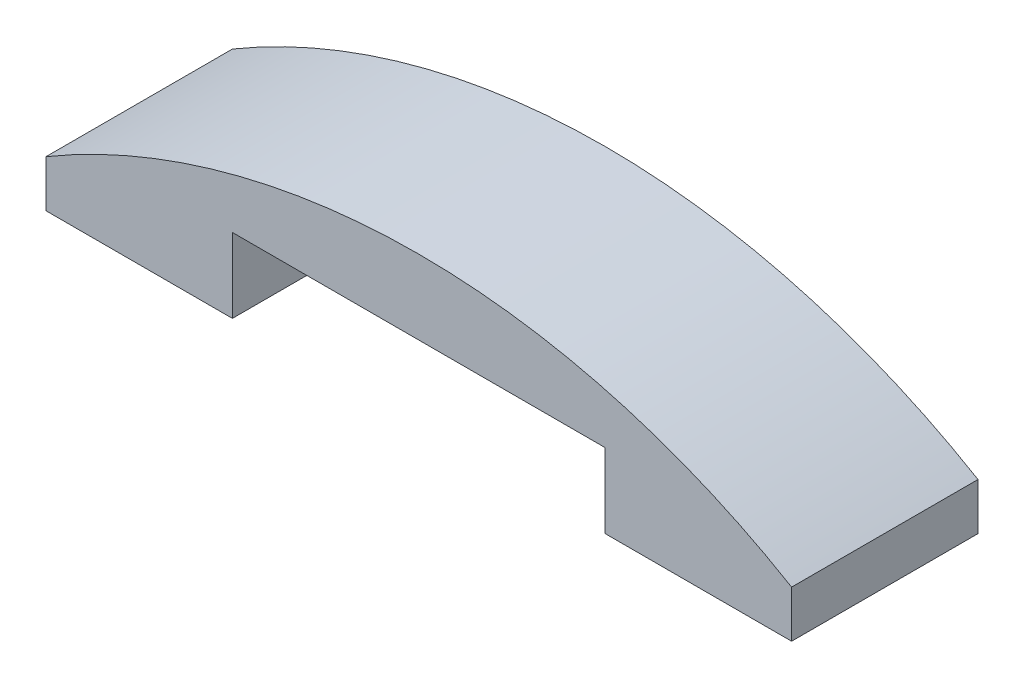
ISO-10303-21;
HEADER;
FILE_DESCRIPTION(('STEP AP214'),'2;1');
FILE_NAME('part.step','',(''),(''),'','','');
FILE_SCHEMA(('AUTOMOTIVE_DESIGN { 1 0 10303 214 1 1 1 1 }'));
ENDSEC;
DATA;
#1=APPLICATION_CONTEXT('core data for automotive mechanical design processes');
#2=APPLICATION_PROTOCOL_DEFINITION('international standard','automotive_design',2000,#1);
#3=PRODUCT_CONTEXT('',#1,'mechanical');
#4=PRODUCT('Part','Part','',(#3));
#5=PRODUCT_RELATED_PRODUCT_CATEGORY('part','',(#4));
#6=PRODUCT_DEFINITION_FORMATION('','',#4);
#7=PRODUCT_DEFINITION_CONTEXT('part definition',#1,'design');
#8=PRODUCT_DEFINITION('design','',#6,#7);
#9=PRODUCT_DEFINITION_SHAPE('','',#8);
#10=(LENGTH_UNIT() NAMED_UNIT(*) SI_UNIT(.MILLI.,.METRE.));
#11=(NAMED_UNIT(*) PLANE_ANGLE_UNIT() SI_UNIT($,.RADIAN.));
#12=(NAMED_UNIT(*) SI_UNIT($,.STERADIAN.) SOLID_ANGLE_UNIT());
#13=UNCERTAINTY_MEASURE_WITH_UNIT(LENGTH_MEASURE(1.E-05),#10,'distance_accuracy_value','');
#14=(GEOMETRIC_REPRESENTATION_CONTEXT(3) GLOBAL_UNCERTAINTY_ASSIGNED_CONTEXT((#13)) GLOBAL_UNIT_ASSIGNED_CONTEXT((#10,
#11,#12)) REPRESENTATION_CONTEXT('',''));
#15=CARTESIAN_POINT('',(0.,0.,0.));
#16=DIRECTION('',(0.,0.,1.));
#17=DIRECTION('',(1.,0.,0.));
#18=AXIS2_PLACEMENT_3D('',#15,#16,#17);
#19=CARTESIAN_POINT('',(0.,-24.8836206896552,7.95));
#20=DIRECTION('',(0.,0.,-1.));
#21=DIRECTION('',(-1.,0.,0.));
#22=AXIS2_PLACEMENT_3D('',#19,#20,#21);
#23=CYLINDRICAL_SURFACE('',#22,30.5336206896552);
#24=CARTESIAN_POINT('',(0.,-24.8836206896552,0.699999999999999));
#25=DIRECTION('',(0.,0.,-1.));
#26=DIRECTION('',(-1.,0.,0.));
#27=AXIS2_PLACEMENT_3D('',#24,#25,#26);
#28=CIRCLE('',#27,30.5336206896552);
#29=CARTESIAN_POINT('',(15.2,1.59773109645533,0.699999999999999));
#30=VERTEX_POINT('',#29);
#31=CARTESIAN_POINT('',(-15.2,1.59773109645533,0.699999999999999));
#32=VERTEX_POINT('',#31);
#33=EDGE_CURVE('E184',#30,#32,#28,.F.);
#34=ORIENTED_EDGE('',*,*,#33,.F.);
#35=DIRECTION('',(0.,0.,-1.));
#36=VECTOR('',#35,1.);
#37=CARTESIAN_POINT('',(15.2,1.59773109645533,7.25));
#38=LINE('',#37,#36);
#39=CARTESIAN_POINT('',(15.2,1.59773109645533,7.25));
#40=VERTEX_POINT('',#39);
#41=EDGE_CURVE('E171',#40,#30,#38,.T.);
#42=ORIENTED_EDGE('',*,*,#41,.F.);
#43=CARTESIAN_POINT('',(0.,-24.8836206896552,7.25));
#44=DIRECTION('',(0.,0.,-1.));
#45=DIRECTION('',(-1.,0.,0.));
#46=AXIS2_PLACEMENT_3D('',#43,#44,#45);
#47=CIRCLE('',#46,30.5336206896552);
#48=CARTESIAN_POINT('',(-15.2,1.59773109645533,7.25));
#49=VERTEX_POINT('',#48);
#50=EDGE_CURVE('E177',#40,#49,#47,.F.);
#51=ORIENTED_EDGE('',*,*,#50,.T.);
#52=DIRECTION('',(0.,0.,-1.));
#53=VECTOR('',#52,1.);
#54=CARTESIAN_POINT('',(-15.2,1.59773109645533,7.25));
#55=LINE('',#54,#53);
#56=EDGE_CURVE('E185',#49,#32,#55,.T.);
#57=ORIENTED_EDGE('',*,*,#56,.T.);
#58=EDGE_LOOP('',(#34,#42,#51,#57));
#59=FACE_BOUND('',#58,.T.);
#60=CARTESIAN_POINT('',(0.,5.65,5.525));
#61=CARTESIAN_POINT('',(0.0870040594812946,5.64999947383263,5.52499616086373));
#62=CARTESIAN_POINT('',(0.174069776851064,5.64962414685411,5.51764987349513));
#63=CARTESIAN_POINT('',(0.345799254136158,5.64816297559538,5.48844832849267));
#64=CARTESIAN_POINT('',(0.430460063336178,5.64707629474054,5.46657598731988));
#65=CARTESIAN_POINT('',(0.594867213495364,5.64431540641607,5.40895028682981));
#66=CARTESIAN_POINT('',(0.674616039780241,5.64264149898557,5.37320401530595));
#67=CARTESIAN_POINT('',(0.826959805951322,5.63889466601426,5.28885608345966));
#68=CARTESIAN_POINT('',(0.89955642630858,5.63682183454369,5.2402574528418));
#69=CARTESIAN_POINT('',(1.03563187099162,5.63250792142471,5.13152830553152));
#70=CARTESIAN_POINT('',(1.09910235980805,5.63026668877285,5.07138736204052));
#71=CARTESIAN_POINT('',(1.21505279789673,5.62586987508656,4.94130163683761));
#72=CARTESIAN_POINT('',(1.26753229765325,5.62371429755824,4.87135645434157));
#73=CARTESIAN_POINT('',(1.36003424530167,5.61973079485169,4.72360374708968));
#74=CARTESIAN_POINT('',(1.40005015233963,5.61790304192746,4.64579212232593));
#75=CARTESIAN_POINT('',(1.46644705505788,5.61478314796291,4.48454416873015));
#76=CARTESIAN_POINT('',(1.49282815656384,5.61349100276553,4.40110788355924));
#77=CARTESIAN_POINT('',(1.53118447856174,5.61158940726855,4.23105601783902));
#78=CARTESIAN_POINT('',(1.54317221595444,5.61097936382463,4.14444326729827));
#79=CARTESIAN_POINT('',(1.55244014216201,5.61050898474049,3.97043283248053));
#80=CARTESIAN_POINT('',(1.54972044980338,5.61064864304317,3.88303515455092));
#81=CARTESIAN_POINT('',(1.52966114304942,5.6116613671164,3.71002085556066));
#82=CARTESIAN_POINT('',(1.51233505399109,5.61253375438651,3.62440266184831));
#83=CARTESIAN_POINT('',(1.46357573876816,5.61491254189686,3.457291543204));
#84=CARTESIAN_POINT('',(1.43214245162424,5.61641894487767,3.37579863610558));
#85=CARTESIAN_POINT('',(1.35604557478348,5.61989676227944,3.21920781000301));
#86=CARTESIAN_POINT('',(1.31137582045836,5.62186839328401,3.14411289176643));
#87=CARTESIAN_POINT('',(1.21007850968265,5.62605422576914,3.00248253326573));
#88=CARTESIAN_POINT('',(1.15345086610146,5.62826842901713,2.93594715537599));
#89=CARTESIAN_POINT('',(1.02976891002292,5.63269286119406,2.81324585202942));
#90=CARTESIAN_POINT('',(0.962702885358677,5.63490308280266,2.75709173140195));
#91=CARTESIAN_POINT('',(0.820089081771725,5.63906802981405,2.656837922189));
#92=CARTESIAN_POINT('',(0.744541300720823,5.64102275515273,2.61273823662816));
#93=CARTESIAN_POINT('',(0.587101589759732,5.64445650017159,2.537846250763));
#94=CARTESIAN_POINT('',(0.505209462645692,5.64593550505738,2.50705436430619));
#95=CARTESIAN_POINT('',(0.337408747817767,5.6482509095457,2.45965977084655));
#96=CARTESIAN_POINT('',(0.251500191098295,5.64908731410624,2.44305695436703));
#97=CARTESIAN_POINT('',(0.07820772455836,5.6500226171265,2.42452634769985));
#98=CARTESIAN_POINT('',(-0.00917443505672073,5.65012233615205,2.42258222969909));
#99=CARTESIAN_POINT('',(-0.183023733180197,5.64957520850135,2.43338159337494));
#100=CARTESIAN_POINT('',(-0.269490874808616,5.64892836437156,2.44612502495372));
#101=CARTESIAN_POINT('',(-0.439009884936366,5.64696149235882,2.48592423399739));
#102=CARTESIAN_POINT('',(-0.522063508633462,5.64564181524061,2.51297255423852));
#103=CARTESIAN_POINT('',(-0.682451968189103,5.64247784890565,2.58060617674385));
#104=CARTESIAN_POINT('',(-0.759786770104113,5.64063355657542,2.62119155934816));
#105=CARTESIAN_POINT('',(-0.906617294697866,5.63662577622214,2.71478902627817));
#106=CARTESIAN_POINT('',(-0.976106034030486,5.63446200774204,2.76781205350667));
#107=CARTESIAN_POINT('',(-1.10520168268703,5.63005988316925,2.88476369565647));
#108=CARTESIAN_POINT('',(-1.16480852676326,5.62782152658421,2.94869238257948));
#109=CARTESIAN_POINT('',(-1.27250335346789,5.62352016923219,3.08571089456004));
#110=CARTESIAN_POINT('',(-1.32058077029914,5.62145733042149,3.15880902997345));
#111=CARTESIAN_POINT('',(-1.4037797836461,5.61774217366867,3.31204947168775));
#112=CARTESIAN_POINT('',(-1.4389014378427,5.61608985389887,3.39219174662516));
#113=CARTESIAN_POINT('',(-1.49517353562003,5.61338321702781,3.55720640852777));
#114=CARTESIAN_POINT('',(-1.51633071021749,5.61232861185692,3.64207649521712));
#115=CARTESIAN_POINT('',(-1.54409528746996,5.61093551914881,3.81416980841175));
#116=CARTESIAN_POINT('',(-1.5507027761008,5.61059702737999,3.90139302100905));
#117=CARTESIAN_POINT('',(-1.54917960342835,5.61067443722686,4.07561147078868));
#118=CARTESIAN_POINT('',(-1.54106556324304,5.61108948806709,4.16260685415623));
#119=CARTESIAN_POINT('',(-1.51036402411425,5.61262540617683,4.33399855507478));
#120=CARTESIAN_POINT('',(-1.48777649765172,5.61374627478835,4.41839486768374));
#121=CARTESIAN_POINT('',(-1.42877258084142,5.61656730633899,4.5821961434822));
#122=CARTESIAN_POINT('',(-1.39235609788731,5.6182674731574,4.66160107324249));
#123=CARTESIAN_POINT('',(-1.30673082172142,5.62205542846763,4.81317097542763));
#124=CARTESIAN_POINT('',(-1.25752241765201,5.62414320516744,4.88533616799962));
#125=CARTESIAN_POINT('',(-1.14765046972581,5.62847376546093,5.02046121169804));
#126=CARTESIAN_POINT('',(-1.08697530441116,5.63071670483568,5.08341160784033));
#127=CARTESIAN_POINT('',(-0.955900487069461,5.63510367892759,5.19825271200747));
#128=CARTESIAN_POINT('',(-0.885498447109781,5.63724768918486,5.25014069624798));
#129=CARTESIAN_POINT('',(-0.736911724777956,5.64119673247876,5.34140908518008));
#130=CARTESIAN_POINT('',(-0.658719534445111,5.64300143356644,5.38077726740762));
#131=CARTESIAN_POINT('',(-0.496884513941508,5.64606356924861,5.44577958295773));
#132=CARTESIAN_POINT('',(-0.4132482504971,5.64732164961916,5.47142993080909));
#133=CARTESIAN_POINT('',(-0.274243987250401,5.64881619248384,5.50154367405768));
#134=CARTESIAN_POINT('',(-0.219776243909713,5.64925816814422,5.51032855844854));
#135=CARTESIAN_POINT('',(-0.11021391558148,5.64985023844403,5.52205793494242));
#136=CARTESIAN_POINT('',(-0.055119331146409,5.65000033334069,5.52500243219253));
#137=CARTESIAN_POINT('',(0.,5.65,5.525));
#138=B_SPLINE_CURVE_WITH_KNOTS('',3,(#60,#61,#62,#63,#64,#65,#66,#67,#68,#69,#70,#71,#72,#73,
#74,#75,#76,#77,#78,#79,#80,#81,#82,#83,#84,#85,#86,#87,#88,#89,#90,#91,#92,#93,#94,#95,#96,#97,
#98,#99,#100,#101,#102,#103,#104,#105,#106,#107,#108,#109,#110,#111,#112,#113,#114,#115,#116,
#117,#118,#119,#120,#121,#122,#123,#124,#125,#126,#127,#128,#129,#130,#131,#132,#133,#134,#135,
#136,#137),.UNSPECIFIED.,.T.,.F.,(4,2,2,2,2,2,2,2,2,2,2,2,2,2,2,2,2,2,2,2,2,2,2,2,2,2,2,2,2,2,2,
2,2,2,2,2,2,2,4),(0.,0.260810971659144,0.521929217629925,0.782914240986913,1.04383779673422,
1.3049981779028,1.56616923807274,1.82747712994327,2.08878299365877,2.34986145299573,
2.61093780299117,2.87177266482337,3.13260865414271,3.39356631421826,3.65452587581513,
3.91578038098094,4.17703495169922,4.43829764635876,4.69955832521101,4.96052795185258,
5.22149668835457,5.48232951420407,5.74316388807828,6.00422861605442,6.26529506770754,
6.52659985934065,6.78790348759381,7.04908107276592,7.31025711460452,7.57113846308632,
7.83202030759428,8.09290389914225,8.35377955529258,8.6149210383719,8.87612674557459,
9.13758667771896,9.39873687639808,9.56396754573068,9.72919806944651),.UNSPECIFIED.);
#139=CARTESIAN_POINT('',(0.,5.65,5.525));
#140=VERTEX_POINT('',#139);
#141=EDGE_CURVE('E40',#140,#140,#138,.T.);
#142=ORIENTED_EDGE('',*,*,#141,.T.);
#143=EDGE_LOOP('',(#142));
#144=FACE_BOUND('',#143,.T.);
#145=ADVANCED_FACE('F36',(#59,#144),#23,.F.);
#146=CARTESIAN_POINT('',(-7.95,0.,7.95));
#147=DIRECTION('',(0.,1.,0.));
#148=DIRECTION('',(-1.,0.,0.));
#149=AXIS2_PLACEMENT_3D('',#146,#147,#148);
#150=PLANE('',#149);
#151=DIRECTION('',(1.,0.,0.));
#152=VECTOR('',#151,1.);
#153=CARTESIAN_POINT('',(-7.95,0.,0.));
#154=LINE('',#153,#152);
#155=CARTESIAN_POINT('',(-15.9,0.,0.));
#156=VERTEX_POINT('',#155);
#157=CARTESIAN_POINT('',(-7.95,0.,0.));
#158=VERTEX_POINT('',#157);
#159=EDGE_CURVE('E222',#156,#158,#154,.T.);
#160=ORIENTED_EDGE('',*,*,#159,.T.);
#161=DIRECTION('',(0.,0.,-1.));
#162=VECTOR('',#161,1.);
#163=CARTESIAN_POINT('',(-7.95,0.,7.95));
#164=LINE('',#163,#162);
#165=CARTESIAN_POINT('',(-7.95,0.,7.95));
#166=VERTEX_POINT('',#165);
#167=EDGE_CURVE('E295',#166,#158,#164,.T.);
#168=ORIENTED_EDGE('',*,*,#167,.F.);
#169=DIRECTION('',(1.,0.,0.));
#170=VECTOR('',#169,1.);
#171=CARTESIAN_POINT('',(-7.95,0.,7.95));
#172=LINE('',#171,#170);
#173=CARTESIAN_POINT('',(-15.9,0.,7.95));
#174=VERTEX_POINT('',#173);
#175=EDGE_CURVE('E236',#174,#166,#172,.T.);
#176=ORIENTED_EDGE('',*,*,#175,.F.);
#177=DIRECTION('',(0.,0.,-1.));
#178=VECTOR('',#177,1.);
#179=CARTESIAN_POINT('',(-15.9,0.,7.95));
#180=LINE('',#179,#178);
#181=EDGE_CURVE('E254',#174,#156,#180,.T.);
#182=ORIENTED_EDGE('',*,*,#181,.T.);
#183=EDGE_LOOP('',(#160,#168,#176,#182));
#184=FACE_BOUND('',#183,.T.);
#185=DIRECTION('',(1.,0.,0.));
#186=VECTOR('',#185,1.);
#187=CARTESIAN_POINT('',(0.,0.,0.699999999999999));
#188=LINE('',#187,#186);
#189=CARTESIAN_POINT('',(-15.2,0.,0.699999999999999));
#190=VERTEX_POINT('',#189);
#191=CARTESIAN_POINT('',(-8.65,0.,0.699999999999999));
#192=VERTEX_POINT('',#191);
#193=EDGE_CURVE('E227',#190,#192,#188,.T.);
#194=ORIENTED_EDGE('',*,*,#193,.F.);
#195=DIRECTION('',(0.,0.,-1.));
#196=VECTOR('',#195,1.);
#197=CARTESIAN_POINT('',(-15.2,0.,7.95));
#198=LINE('',#197,#196);
#199=CARTESIAN_POINT('',(-15.2,0.,7.25));
#200=VERTEX_POINT('',#199);
#201=EDGE_CURVE('E190',#200,#190,#198,.T.);
#202=ORIENTED_EDGE('',*,*,#201,.F.);
#203=DIRECTION('',(1.,0.,0.));
#204=VECTOR('',#203,1.);
#205=CARTESIAN_POINT('',(0.,0.,7.25));
#206=LINE('',#205,#204);
#207=CARTESIAN_POINT('',(-8.65,0.,7.25));
#208=VERTEX_POINT('',#207);
#209=EDGE_CURVE('E57',#200,#208,#206,.T.);
#210=ORIENTED_EDGE('',*,*,#209,.T.);
#211=DIRECTION('',(0.,0.,-1.));
#212=VECTOR('',#211,1.);
#213=CARTESIAN_POINT('',(-8.65,0.,7.95));
#214=LINE('',#213,#212);
#215=EDGE_CURVE('E207',#208,#192,#214,.T.);
#216=ORIENTED_EDGE('',*,*,#215,.T.);
#217=EDGE_LOOP('',(#194,#202,#210,#216));
#218=FACE_BOUND('',#217,.T.);
#219=ADVANCED_FACE('F38',(#184,#218),#150,.F.);
#220=CARTESIAN_POINT('',(-7.95,3.175,7.95));
#221=DIRECTION('',(0.,1.,0.));
#222=DIRECTION('',(0.,0.,1.));
#223=AXIS2_PLACEMENT_3D('',#220,#221,#222);
#224=PLANE('',#223);
#225=DIRECTION('',(1.,0.,0.));
#226=VECTOR('',#225,1.);
#227=CARTESIAN_POINT('',(0.,3.175,0.699999999999999));
#228=LINE('',#227,#226);
#229=CARTESIAN_POINT('',(-7.95,3.175,0.699999999999999));
#230=VERTEX_POINT('',#229);
#231=CARTESIAN_POINT('',(7.95,3.175,0.699999999999999));
#232=VERTEX_POINT('',#231);
#233=EDGE_CURVE('E50',#230,#232,#228,.T.);
#234=ORIENTED_EDGE('',*,*,#233,.F.);
#235=DIRECTION('',(0.,0.,-1.));
#236=VECTOR('',#235,1.);
#237=CARTESIAN_POINT('',(-7.95,3.175,7.95));
#238=LINE('',#237,#236);
#239=CARTESIAN_POINT('',(-7.95,3.175,0.));
#240=VERTEX_POINT('',#239);
#241=EDGE_CURVE('E290',#230,#240,#238,.T.);
#242=ORIENTED_EDGE('',*,*,#241,.T.);
#243=DIRECTION('',(1.,0.,0.));
#244=VECTOR('',#243,1.);
#245=CARTESIAN_POINT('',(-7.95,3.175,0.));
#246=LINE('',#245,#244);
#247=CARTESIAN_POINT('',(7.95,3.175,0.));
#248=VERTEX_POINT('',#247);
#249=EDGE_CURVE('E260',#240,#248,#246,.T.);
#250=ORIENTED_EDGE('',*,*,#249,.T.);
#251=DIRECTION('',(0.,0.,-1.));
#252=VECTOR('',#251,1.);
#253=CARTESIAN_POINT('',(7.95,3.175,7.95));
#254=LINE('',#253,#252);
#255=EDGE_CURVE('E286',#232,#248,#254,.T.);
#256=ORIENTED_EDGE('',*,*,#255,.F.);
#257=EDGE_LOOP('',(#234,#242,#250,#256));
#258=FACE_BOUND('',#257,.T.);
#259=ADVANCED_FACE('F339',(#258),#224,.F.);
#260=CARTESIAN_POINT('',(7.95,0.,7.95));
#261=DIRECTION('',(0.,1.,0.));
#262=DIRECTION('',(-1.,0.,0.));
#263=AXIS2_PLACEMENT_3D('',#260,#261,#262);
#264=PLANE('',#263);
#265=DIRECTION('',(1.,0.,0.));
#266=VECTOR('',#265,1.);
#267=CARTESIAN_POINT('',(7.95,0.,0.));
#268=LINE('',#267,#266);
#269=CARTESIAN_POINT('',(7.95,0.,0.));
#270=VERTEX_POINT('',#269);
#271=CARTESIAN_POINT('',(15.9,0.,0.));
#272=VERTEX_POINT('',#271);
#273=EDGE_CURVE('E265',#270,#272,#268,.T.);
#274=ORIENTED_EDGE('',*,*,#273,.T.);
#275=DIRECTION('',(0.,0.,-1.));
#276=VECTOR('',#275,1.);
#277=CARTESIAN_POINT('',(15.9,0.,7.95));
#278=LINE('',#277,#276);
#279=CARTESIAN_POINT('',(15.9,0.,7.95));
#280=VERTEX_POINT('',#279);
#281=EDGE_CURVE('E280',#280,#272,#278,.T.);
#282=ORIENTED_EDGE('',*,*,#281,.F.);
#283=DIRECTION('',(1.,0.,0.));
#284=VECTOR('',#283,1.);
#285=CARTESIAN_POINT('',(7.95,0.,7.95));
#286=LINE('',#285,#284);
#287=CARTESIAN_POINT('',(7.95,0.,7.95));
#288=VERTEX_POINT('',#287);
#289=EDGE_CURVE('E246',#288,#280,#286,.T.);
#290=ORIENTED_EDGE('',*,*,#289,.F.);
#291=DIRECTION('',(0.,0.,-1.));
#292=VECTOR('',#291,1.);
#293=CARTESIAN_POINT('',(7.95,0.,7.95));
#294=LINE('',#293,#292);
#295=EDGE_CURVE('E283',#288,#270,#294,.T.);
#296=ORIENTED_EDGE('',*,*,#295,.T.);
#297=EDGE_LOOP('',(#274,#282,#290,#296));
#298=FACE_BOUND('',#297,.T.);
#299=DIRECTION('',(1.,0.,0.));
#300=VECTOR('',#299,1.);
#301=CARTESIAN_POINT('',(0.,0.,0.699999999999999));
#302=LINE('',#301,#300);
#303=CARTESIAN_POINT('',(8.65,0.,0.699999999999999));
#304=VERTEX_POINT('',#303);
#305=CARTESIAN_POINT('',(15.2,0.,0.699999999999999));
#306=VERTEX_POINT('',#305);
#307=EDGE_CURVE('E196',#304,#306,#302,.T.);
#308=ORIENTED_EDGE('',*,*,#307,.F.);
#309=DIRECTION('',(0.,0.,-1.));
#310=VECTOR('',#309,1.);
#311=CARTESIAN_POINT('',(8.65,0.,7.95));
#312=LINE('',#311,#310);
#313=CARTESIAN_POINT('',(8.65,0.,7.25));
#314=VERTEX_POINT('',#313);
#315=EDGE_CURVE('E214',#314,#304,#312,.T.);
#316=ORIENTED_EDGE('',*,*,#315,.F.);
#317=DIRECTION('',(1.,0.,0.));
#318=VECTOR('',#317,1.);
#319=CARTESIAN_POINT('',(0.,0.,7.25));
#320=LINE('',#319,#318);
#321=CARTESIAN_POINT('',(15.2,0.,7.25));
#322=VERTEX_POINT('',#321);
#323=EDGE_CURVE('E178',#314,#322,#320,.T.);
#324=ORIENTED_EDGE('',*,*,#323,.T.);
#325=DIRECTION('',(0.,0.,-1.));
#326=VECTOR('',#325,1.);
#327=CARTESIAN_POINT('',(15.2,0.,7.95));
#328=LINE('',#327,#326);
#329=EDGE_CURVE('E174',#322,#306,#328,.T.);
#330=ORIENTED_EDGE('',*,*,#329,.T.);
#331=EDGE_LOOP('',(#308,#316,#324,#330));
#332=FACE_BOUND('',#331,.T.);
#333=ADVANCED_FACE('F367',(#298,#332),#264,.F.);
#334=CARTESIAN_POINT('',(-7.95,0.,7.95));
#335=DIRECTION('',(-1.,0.,0.));
#336=DIRECTION('',(0.,0.,1.));
#337=AXIS2_PLACEMENT_3D('',#334,#335,#336);
#338=PLANE('',#337);
#339=DIRECTION('',(0.,1.,0.));
#340=VECTOR('',#339,1.);
#341=CARTESIAN_POINT('',(-7.95,0.,0.));
#342=LINE('',#341,#340);
#343=EDGE_CURVE('E257',#158,#240,#342,.T.);
#344=ORIENTED_EDGE('',*,*,#343,.T.);
#345=ORIENTED_EDGE('',*,*,#241,.F.);
#346=CARTESIAN_POINT('',(-7.95,3.175,7.25));
#347=VERTEX_POINT('',#346);
#348=EDGE_CURVE('E296',#347,#230,#238,.T.);
#349=ORIENTED_EDGE('',*,*,#348,.F.);
#350=CARTESIAN_POINT('',(-7.95,3.175,7.95));
#351=VERTEX_POINT('',#350);
#352=EDGE_CURVE('E292',#351,#347,#238,.T.);
#353=ORIENTED_EDGE('',*,*,#352,.F.);
#354=DIRECTION('',(0.,1.,0.));
#355=VECTOR('',#354,1.);
#356=CARTESIAN_POINT('',(-7.95,0.,7.95));
#357=LINE('',#356,#355);
#358=EDGE_CURVE('E239',#166,#351,#357,.T.);
#359=ORIENTED_EDGE('',*,*,#358,.F.);
#360=ORIENTED_EDGE('',*,*,#167,.T.);
#361=EDGE_LOOP('',(#344,#345,#349,#353,#359,#360));
#362=FACE_BOUND('',#361,.T.);
#363=ADVANCED_FACE('F393',(#362),#338,.F.);
#364=ORIENTED_EDGE('',*,*,#352,.T.);
#365=DIRECTION('',(1.,0.,0.));
#366=VECTOR('',#365,1.);
#367=CARTESIAN_POINT('',(0.,3.175,7.25));
#368=LINE('',#367,#366);
#369=CARTESIAN_POINT('',(7.95,3.175,7.25));
#370=VERTEX_POINT('',#369);
#371=EDGE_CURVE('E219',#347,#370,#368,.T.);
#372=ORIENTED_EDGE('',*,*,#371,.T.);
#373=CARTESIAN_POINT('',(7.95,3.175,7.95));
#374=VERTEX_POINT('',#373);
#375=EDGE_CURVE('E287',#374,#370,#254,.T.);
#376=ORIENTED_EDGE('',*,*,#375,.F.);
#377=DIRECTION('',(1.,0.,0.));
#378=VECTOR('',#377,1.);
#379=CARTESIAN_POINT('',(-7.95,3.175,7.95));
#380=LINE('',#379,#378);
#381=EDGE_CURVE('E242',#351,#374,#380,.T.);
#382=ORIENTED_EDGE('',*,*,#381,.F.);
#383=EDGE_LOOP('',(#364,#372,#376,#382));
#384=FACE_BOUND('',#383,.T.);
#385=ADVANCED_FACE('F377',(#384),#224,.F.);
#386=CARTESIAN_POINT('',(7.95,3.175,7.95));
#387=DIRECTION('',(1.,0.,0.));
#388=DIRECTION('',(0.,0.,-1.));
#389=AXIS2_PLACEMENT_3D('',#386,#387,#388);
#390=PLANE('',#389);
#391=DIRECTION('',(0.,-1.,0.));
#392=VECTOR('',#391,1.);
#393=CARTESIAN_POINT('',(7.95,3.175,0.));
#394=LINE('',#393,#392);
#395=EDGE_CURVE('E263',#248,#270,#394,.T.);
#396=ORIENTED_EDGE('',*,*,#395,.T.);
#397=ORIENTED_EDGE('',*,*,#295,.F.);
#398=DIRECTION('',(0.,-1.,0.));
#399=VECTOR('',#398,1.);
#400=CARTESIAN_POINT('',(7.95,3.175,7.95));
#401=LINE('',#400,#399);
#402=EDGE_CURVE('E244',#374,#288,#401,.T.);
#403=ORIENTED_EDGE('',*,*,#402,.F.);
#404=ORIENTED_EDGE('',*,*,#375,.T.);
#405=EDGE_CURVE('E291',#370,#232,#254,.T.);
#406=ORIENTED_EDGE('',*,*,#405,.T.);
#407=ORIENTED_EDGE('',*,*,#255,.T.);
#408=EDGE_LOOP('',(#396,#397,#403,#404,#406,#407));
#409=FACE_BOUND('',#408,.T.);
#410=ADVANCED_FACE('F383',(#409),#390,.F.);
#411=CARTESIAN_POINT('',(15.9,0.,7.95));
#412=DIRECTION('',(-1.,0.,0.));
#413=DIRECTION('',(0.,0.,1.));
#414=AXIS2_PLACEMENT_3D('',#411,#412,#413);
#415=PLANE('',#414);
#416=DIRECTION('',(0.,1.,0.));
#417=VECTOR('',#416,1.);
#418=CARTESIAN_POINT('',(15.9,0.,0.));
#419=LINE('',#418,#417);
#420=CARTESIAN_POINT('',(15.9,2.,0.));
#421=VERTEX_POINT('',#420);
#422=EDGE_CURVE('E267',#272,#421,#419,.T.);
#423=ORIENTED_EDGE('',*,*,#422,.T.);
#424=DIRECTION('',(0.,0.,-1.));
#425=VECTOR('',#424,1.);
#426=CARTESIAN_POINT('',(15.9,2.,7.95));
#427=LINE('',#426,#425);
#428=CARTESIAN_POINT('',(15.9,2.,7.95));
#429=VERTEX_POINT('',#428);
#430=EDGE_CURVE('E277',#429,#421,#427,.T.);
#431=ORIENTED_EDGE('',*,*,#430,.F.);
#432=DIRECTION('',(0.,1.,0.));
#433=VECTOR('',#432,1.);
#434=CARTESIAN_POINT('',(15.9,0.,7.95));
#435=LINE('',#434,#433);
#436=EDGE_CURVE('E248',#280,#429,#435,.T.);
#437=ORIENTED_EDGE('',*,*,#436,.F.);
#438=ORIENTED_EDGE('',*,*,#281,.T.);
#439=EDGE_LOOP('',(#423,#431,#437,#438));
#440=FACE_BOUND('',#439,.T.);
#441=ADVANCED_FACE('F409',(#440),#415,.F.);
#442=CARTESIAN_POINT('',(-15.9,0.,7.95));
#443=DIRECTION('',(1.,0.,0.));
#444=DIRECTION('',(0.,0.,-1.));
#445=AXIS2_PLACEMENT_3D('',#442,#443,#444);
#446=PLANE('',#445);
#447=DIRECTION('',(0.,-1.,0.));
#448=VECTOR('',#447,1.);
#449=CARTESIAN_POINT('',(-15.9,0.,0.));
#450=LINE('',#449,#448);
#451=CARTESIAN_POINT('',(-15.9,2.,0.));
#452=VERTEX_POINT('',#451);
#453=EDGE_CURVE('E240',#452,#156,#450,.T.);
#454=ORIENTED_EDGE('',*,*,#453,.T.);
#455=ORIENTED_EDGE('',*,*,#181,.F.);
#456=DIRECTION('',(0.,-1.,0.));
#457=VECTOR('',#456,1.);
#458=CARTESIAN_POINT('',(-15.9,0.,7.95));
#459=LINE('',#458,#457);
#460=CARTESIAN_POINT('',(-15.9,2.,7.95));
#461=VERTEX_POINT('',#460);
#462=EDGE_CURVE('E252',#461,#174,#459,.T.);
#463=ORIENTED_EDGE('',*,*,#462,.F.);
#464=DIRECTION('',(0.,0.,-1.));
#465=VECTOR('',#464,1.);
#466=CARTESIAN_POINT('',(-15.9,2.,7.95));
#467=LINE('',#466,#465);
#468=EDGE_CURVE('E274',#461,#452,#467,.T.);
#469=ORIENTED_EDGE('',*,*,#468,.T.);
#470=EDGE_LOOP('',(#454,#455,#463,#469));
#471=FACE_BOUND('',#470,.T.);
#472=ADVANCED_FACE('F417',(#471),#446,.F.);
#473=CARTESIAN_POINT('',(0.,-24.8836206896552,7.95));
#474=DIRECTION('',(0.,0.,-1.));
#475=DIRECTION('',(-1.,0.,0.));
#476=AXIS2_PLACEMENT_3D('',#473,#474,#475);
#477=PLANE('',#476);
#478=ORIENTED_EDGE('',*,*,#175,.T.);
#479=ORIENTED_EDGE('',*,*,#358,.T.);
#480=ORIENTED_EDGE('',*,*,#381,.T.);
#481=ORIENTED_EDGE('',*,*,#402,.T.);
#482=ORIENTED_EDGE('',*,*,#289,.T.);
#483=ORIENTED_EDGE('',*,*,#436,.T.);
#484=CARTESIAN_POINT('',(0.,-24.8836206896552,7.95));
#485=DIRECTION('',(0.,0.,1.));
#486=DIRECTION('',(-1.,0.,0.));
#487=AXIS2_PLACEMENT_3D('',#484,#485,#486);
#488=CIRCLE('',#487,31.2336206896552);
#489=EDGE_CURVE('E250',#429,#461,#488,.T.);
#490=ORIENTED_EDGE('',*,*,#489,.T.);
#491=ORIENTED_EDGE('',*,*,#462,.T.);
#492=EDGE_LOOP('',(#478,#479,#480,#481,#482,#483,#490,#491));
#493=FACE_BOUND('',#492,.T.);
#494=ADVANCED_FACE('F387',(#493),#477,.F.);
#495=CARTESIAN_POINT('',(0.,-24.8836206896552,0.));
#496=DIRECTION('',(0.,0.,-1.));
#497=DIRECTION('',(-1.,0.,0.));
#498=AXIS2_PLACEMENT_3D('',#495,#496,#497);
#499=PLANE('',#498);
#500=ORIENTED_EDGE('',*,*,#159,.F.);
#501=ORIENTED_EDGE('',*,*,#453,.F.);
#502=CARTESIAN_POINT('',(0.,-24.8836206896552,0.));
#503=DIRECTION('',(0.,0.,1.));
#504=DIRECTION('',(-1.,0.,0.));
#505=AXIS2_PLACEMENT_3D('',#502,#503,#504);
#506=CIRCLE('',#505,31.2336206896552);
#507=EDGE_CURVE('E269',#421,#452,#506,.T.);
#508=ORIENTED_EDGE('',*,*,#507,.F.);
#509=ORIENTED_EDGE('',*,*,#422,.F.);
#510=ORIENTED_EDGE('',*,*,#273,.F.);
#511=ORIENTED_EDGE('',*,*,#395,.F.);
#512=ORIENTED_EDGE('',*,*,#249,.F.);
#513=ORIENTED_EDGE('',*,*,#343,.F.);
#514=EDGE_LOOP('',(#500,#501,#508,#509,#510,#511,#512,#513));
#515=FACE_BOUND('',#514,.T.);
#516=ADVANCED_FACE('F402',(#515),#499,.T.);
#517=CARTESIAN_POINT('',(-7.95,3.175,7.95));
#518=DIRECTION('',(0.,1.,0.));
#519=DIRECTION('',(0.,0.,1.));
#520=AXIS2_PLACEMENT_3D('',#517,#518,#519);
#521=PLANE('',#520);
#522=ORIENTED_EDGE('',*,*,#348,.T.);
#523=CARTESIAN_POINT('',(-8.65,3.175,0.699999999999999));
#524=VERTEX_POINT('',#523);
#525=EDGE_CURVE('E197',#524,#230,#228,.T.);
#526=ORIENTED_EDGE('',*,*,#525,.F.);
#527=DIRECTION('',(0.,0.,-1.));
#528=VECTOR('',#527,1.);
#529=CARTESIAN_POINT('',(-8.65,3.175,7.95));
#530=LINE('',#529,#528);
#531=CARTESIAN_POINT('',(-8.65,3.175,7.25));
#532=VERTEX_POINT('',#531);
#533=EDGE_CURVE('E204',#532,#524,#530,.T.);
#534=ORIENTED_EDGE('',*,*,#533,.F.);
#535=EDGE_CURVE('E215',#532,#347,#368,.T.);
#536=ORIENTED_EDGE('',*,*,#535,.T.);
#537=EDGE_LOOP('',(#522,#526,#534,#536));
#538=FACE_BOUND('',#537,.T.);
#539=ADVANCED_FACE('F323',(#538),#521,.T.);
#540=CARTESIAN_POINT('',(-8.65,0.,7.95));
#541=DIRECTION('',(-1.,0.,0.));
#542=DIRECTION('',(0.,0.,1.));
#543=AXIS2_PLACEMENT_3D('',#540,#541,#542);
#544=PLANE('',#543);
#545=DIRECTION('',(0.,1.,0.));
#546=VECTOR('',#545,1.);
#547=CARTESIAN_POINT('',(-8.65,-24.8836206896552,0.699999999999999));
#548=LINE('',#547,#546);
#549=EDGE_CURVE('E230',#192,#524,#548,.T.);
#550=ORIENTED_EDGE('',*,*,#549,.F.);
#551=ORIENTED_EDGE('',*,*,#215,.F.);
#552=DIRECTION('',(0.,1.,0.));
#553=VECTOR('',#552,1.);
#554=CARTESIAN_POINT('',(-8.65,-24.8836206896552,7.25));
#555=LINE('',#554,#553);
#556=EDGE_CURVE('E224',#208,#532,#555,.T.);
#557=ORIENTED_EDGE('',*,*,#556,.T.);
#558=ORIENTED_EDGE('',*,*,#533,.T.);
#559=EDGE_LOOP('',(#550,#551,#557,#558));
#560=FACE_BOUND('',#559,.T.);
#561=ADVANCED_FACE('F321',(#560),#544,.T.);
#562=CARTESIAN_POINT('',(8.65,3.175,7.25));
#563=VERTEX_POINT('',#562);
#564=EDGE_CURVE('E64',#370,#563,#368,.T.);
#565=ORIENTED_EDGE('',*,*,#564,.T.);
#566=DIRECTION('',(0.,0.,-1.));
#567=VECTOR('',#566,1.);
#568=CARTESIAN_POINT('',(8.65,3.175,7.95));
#569=LINE('',#568,#567);
#570=CARTESIAN_POINT('',(8.65,3.175,0.699999999999999));
#571=VERTEX_POINT('',#570);
#572=EDGE_CURVE('E208',#563,#571,#569,.T.);
#573=ORIENTED_EDGE('',*,*,#572,.T.);
#574=EDGE_CURVE('E211',#232,#571,#228,.T.);
#575=ORIENTED_EDGE('',*,*,#574,.F.);
#576=ORIENTED_EDGE('',*,*,#405,.F.);
#577=EDGE_LOOP('',(#565,#573,#575,#576));
#578=FACE_BOUND('',#577,.T.);
#579=ADVANCED_FACE('F317',(#578),#521,.T.);
#580=CARTESIAN_POINT('',(8.65,3.175,7.95));
#581=DIRECTION('',(1.,0.,0.));
#582=DIRECTION('',(0.,0.,-1.));
#583=AXIS2_PLACEMENT_3D('',#580,#581,#582);
#584=PLANE('',#583);
#585=DIRECTION('',(0.,-1.,0.));
#586=VECTOR('',#585,1.);
#587=CARTESIAN_POINT('',(8.65,-24.8836206896552,0.699999999999999));
#588=LINE('',#587,#586);
#589=EDGE_CURVE('E194',#571,#304,#588,.T.);
#590=ORIENTED_EDGE('',*,*,#589,.F.);
#591=ORIENTED_EDGE('',*,*,#572,.F.);
#592=DIRECTION('',(0.,-1.,0.));
#593=VECTOR('',#592,1.);
#594=CARTESIAN_POINT('',(8.65,-24.8836206896552,7.25));
#595=LINE('',#594,#593);
#596=EDGE_CURVE('E218',#563,#314,#595,.T.);
#597=ORIENTED_EDGE('',*,*,#596,.T.);
#598=ORIENTED_EDGE('',*,*,#315,.T.);
#599=EDGE_LOOP('',(#590,#591,#597,#598));
#600=FACE_BOUND('',#599,.T.);
#601=ADVANCED_FACE('F320',(#600),#584,.T.);
#602=CARTESIAN_POINT('',(15.2,0.,7.95));
#603=DIRECTION('',(-1.,0.,0.));
#604=DIRECTION('',(0.,0.,1.));
#605=AXIS2_PLACEMENT_3D('',#602,#603,#604);
#606=PLANE('',#605);
#607=DIRECTION('',(0.,1.,0.));
#608=VECTOR('',#607,1.);
#609=CARTESIAN_POINT('',(15.2,-24.8836206896552,0.699999999999999));
#610=LINE('',#609,#608);
#611=EDGE_CURVE('E201',#306,#30,#610,.T.);
#612=ORIENTED_EDGE('',*,*,#611,.F.);
#613=ORIENTED_EDGE('',*,*,#329,.F.);
#614=DIRECTION('',(0.,1.,0.));
#615=VECTOR('',#614,1.);
#616=CARTESIAN_POINT('',(15.2,-24.8836206896552,7.25));
#617=LINE('',#616,#615);
#618=EDGE_CURVE('E167',#322,#40,#617,.T.);
#619=ORIENTED_EDGE('',*,*,#618,.T.);
#620=ORIENTED_EDGE('',*,*,#41,.T.);
#621=EDGE_LOOP('',(#612,#613,#619,#620));
#622=FACE_BOUND('',#621,.T.);
#623=ADVANCED_FACE('F170',(#622),#606,.T.);
#624=CARTESIAN_POINT('',(-15.2,0.,7.95));
#625=DIRECTION('',(1.,0.,0.));
#626=DIRECTION('',(0.,0.,-1.));
#627=AXIS2_PLACEMENT_3D('',#624,#625,#626);
#628=PLANE('',#627);
#629=DIRECTION('',(0.,-1.,0.));
#630=VECTOR('',#629,1.);
#631=CARTESIAN_POINT('',(-15.2,-24.8836206896552,0.699999999999999));
#632=LINE('',#631,#630);
#633=EDGE_CURVE('E198',#32,#190,#632,.T.);
#634=ORIENTED_EDGE('',*,*,#633,.F.);
#635=ORIENTED_EDGE('',*,*,#56,.F.);
#636=DIRECTION('',(0.,-1.,0.));
#637=VECTOR('',#636,1.);
#638=CARTESIAN_POINT('',(-15.2,-24.8836206896552,7.25));
#639=LINE('',#638,#637);
#640=EDGE_CURVE('E188',#49,#200,#639,.T.);
#641=ORIENTED_EDGE('',*,*,#640,.T.);
#642=ORIENTED_EDGE('',*,*,#201,.T.);
#643=EDGE_LOOP('',(#634,#635,#641,#642));
#644=FACE_BOUND('',#643,.T.);
#645=ADVANCED_FACE('F330',(#644),#628,.T.);
#646=CARTESIAN_POINT('',(0.,-24.8836206896552,7.25));
#647=DIRECTION('',(0.,0.,-1.));
#648=DIRECTION('',(-1.,0.,0.));
#649=AXIS2_PLACEMENT_3D('',#646,#647,#648);
#650=PLANE('',#649);
#651=ORIENTED_EDGE('',*,*,#209,.F.);
#652=ORIENTED_EDGE('',*,*,#640,.F.);
#653=ORIENTED_EDGE('',*,*,#50,.F.);
#654=ORIENTED_EDGE('',*,*,#618,.F.);
#655=ORIENTED_EDGE('',*,*,#323,.F.);
#656=ORIENTED_EDGE('',*,*,#596,.F.);
#657=ORIENTED_EDGE('',*,*,#564,.F.);
#658=ORIENTED_EDGE('',*,*,#371,.F.);
#659=ORIENTED_EDGE('',*,*,#535,.F.);
#660=ORIENTED_EDGE('',*,*,#556,.F.);
#661=EDGE_LOOP('',(#651,#652,#653,#654,#655,#656,#657,#658,#659,#660));
#662=FACE_BOUND('',#661,.T.);
#663=ADVANCED_FACE('F187',(#662),#650,.T.);
#664=CARTESIAN_POINT('',(0.,-24.8836206896552,0.699999999999999));
#665=DIRECTION('',(0.,0.,-1.));
#666=DIRECTION('',(-1.,0.,0.));
#667=AXIS2_PLACEMENT_3D('',#664,#665,#666);
#668=PLANE('',#667);
#669=ORIENTED_EDGE('',*,*,#193,.T.);
#670=ORIENTED_EDGE('',*,*,#549,.T.);
#671=ORIENTED_EDGE('',*,*,#525,.T.);
#672=ORIENTED_EDGE('',*,*,#233,.T.);
#673=ORIENTED_EDGE('',*,*,#574,.T.);
#674=ORIENTED_EDGE('',*,*,#589,.T.);
#675=ORIENTED_EDGE('',*,*,#307,.T.);
#676=ORIENTED_EDGE('',*,*,#611,.T.);
#677=ORIENTED_EDGE('',*,*,#33,.T.);
#678=ORIENTED_EDGE('',*,*,#633,.T.);
#679=EDGE_LOOP('',(#669,#670,#671,#672,#673,#674,#675,#676,#677,#678));
#680=FACE_BOUND('',#679,.T.);
#681=ADVANCED_FACE('F369',(#680),#668,.F.);
#682=CARTESIAN_POINT('',(0.,-1.20906204335659,3.975));
#683=DIRECTION('',(0.,1.,0.));
#684=DIRECTION('',(0.,0.,1.));
#685=AXIS2_PLACEMENT_3D('',#682,#683,#684);
#686=CYLINDRICAL_SURFACE('',#685,1.55);
#687=ORIENTED_EDGE('',*,*,#141,.F.);
#688=EDGE_LOOP('',(#687));
#689=FACE_BOUND('',#688,.T.);
#690=CARTESIAN_POINT('',(0.,3.175,3.975));
#691=DIRECTION('',(0.,1.,0.));
#692=DIRECTION('',(0.,0.,1.));
#693=AXIS2_PLACEMENT_3D('',#690,#691,#692);
#694=CIRCLE('',#693,1.55);
#695=CARTESIAN_POINT('',(0.,3.175,5.525));
#696=VERTEX_POINT('',#695);
#697=EDGE_CURVE('E354',#696,#696,#694,.T.);
#698=ORIENTED_EDGE('',*,*,#697,.T.);
#699=EDGE_LOOP('',(#698));
#700=FACE_BOUND('',#699,.T.);
#701=ADVANCED_FACE('F312',(#689,#700),#686,.T.);
#702=CARTESIAN_POINT('',(-7.95,3.175,7.95));
#703=DIRECTION('',(0.,1.,0.));
#704=DIRECTION('',(0.,0.,1.));
#705=AXIS2_PLACEMENT_3D('',#702,#703,#704);
#706=PLANE('',#705);
#707=CARTESIAN_POINT('',(0.,3.175,3.975));
#708=DIRECTION('',(0.,1.,0.));
#709=DIRECTION('',(0.,0.,1.));
#710=AXIS2_PLACEMENT_3D('',#707,#708,#709);
#711=CIRCLE('',#710,0.55);
#712=CARTESIAN_POINT('',(0.,3.175,4.525));
#713=VERTEX_POINT('',#712);
#714=EDGE_CURVE('E353',#713,#713,#711,.T.);
#715=ORIENTED_EDGE('',*,*,#714,.T.);
#716=EDGE_LOOP('',(#715));
#717=FACE_BOUND('',#716,.T.);
#718=ORIENTED_EDGE('',*,*,#697,.F.);
#719=EDGE_LOOP('',(#718));
#720=FACE_BOUND('',#719,.T.);
#721=ADVANCED_FACE('F310',(#717,#720),#706,.F.);
#722=CARTESIAN_POINT('',(0.,-1.20906204335659,3.975));
#723=DIRECTION('',(0.,1.,0.));
#724=DIRECTION('',(0.,0.,1.));
#725=AXIS2_PLACEMENT_3D('',#722,#723,#724);
#726=CYLINDRICAL_SURFACE('',#725,0.55);
#727=CARTESIAN_POINT('',(0.,5.65,4.525));
#728=CARTESIAN_POINT('',(0.0308910530074963,5.64999993309934,4.52499863094718));
#729=CARTESIAN_POINT('',(0.0618044411575084,5.64995261779806,4.52238874677785));
#730=CARTESIAN_POINT('',(0.122779662231186,5.64976841624869,4.51201372123094));
#731=CARTESIAN_POINT('',(0.152840427767142,5.64963142248638,4.50424239170691));
#732=CARTESIAN_POINT('',(0.211218213776631,5.64928338135074,4.48376594455787));
#733=CARTESIAN_POINT('',(0.239536066799121,5.64907236966188,4.47106320407999));
#734=CARTESIAN_POINT('',(0.293629361962476,5.64860010754626,4.44108783684532));
#735=CARTESIAN_POINT('',(0.319405429971111,5.64833886953378,4.42381633893753));
#736=CARTESIAN_POINT('',(0.367698094179454,5.64779550476548,4.38518817043294));
#737=CARTESIAN_POINT('',(0.390214017963896,5.64751337371849,4.36383065918531));
#738=CARTESIAN_POINT('',(0.431341706184268,5.64696005971094,4.31763785833418));
#739=CARTESIAN_POINT('',(0.449953316522884,5.64668887718284,4.29280243152711));
#740=CARTESIAN_POINT('',(0.482743886979747,5.64618803364473,4.24035786082834));
#741=CARTESIAN_POINT('',(0.49692262833868,5.64595837468412,4.21274858013749));
#742=CARTESIAN_POINT('',(0.520443477153271,5.64556649531197,4.15554104129262));
#743=CARTESIAN_POINT('',(0.529785597818454,5.64540427471624,4.12594278857102));
#744=CARTESIAN_POINT('',(0.543367078183322,5.64516558264351,4.06560085966156));
#745=CARTESIAN_POINT('',(0.547606989406505,5.64508910189851,4.03485730764531));
#746=CARTESIAN_POINT('',(0.550865387532866,5.6450304846695,3.97309471648828));
#747=CARTESIAN_POINT('',(0.54988388796586,5.64504834794101,3.94207567806156));
#748=CARTESIAN_POINT('',(0.542727811553113,5.64517639568147,3.88064638163951));
#749=CARTESIAN_POINT('',(0.536553836021234,5.64528656946041,3.85023605357004));
#750=CARTESIAN_POINT('',(0.519188991039379,5.6455868007316,3.79088357620538));
#751=CARTESIAN_POINT('',(0.507998114218193,5.64577685834123,3.76194142906743));
#752=CARTESIAN_POINT('',(0.480916448960168,5.64621544297679,3.70634497683633));
#753=CARTESIAN_POINT('',(0.465025384758622,5.6464639734332,3.67969080609947));
#754=CARTESIAN_POINT('',(0.428994651364152,5.64699148126681,3.62942841324703));
#755=CARTESIAN_POINT('',(0.408854979769717,5.6472704586612,3.60582019285319));
#756=CARTESIAN_POINT('',(0.364895316672061,5.64782745686212,3.56231634158824));
#757=CARTESIAN_POINT('',(0.341074802219233,5.64810547752696,3.5424212391403));
#758=CARTESIAN_POINT('',(0.290431486739451,5.64862918048307,3.50691244806365));
#759=CARTESIAN_POINT('',(0.263608685290035,5.64887486276978,3.49129876003739));
#760=CARTESIAN_POINT('',(0.207721924127554,5.64930619267892,3.46479608521894));
#761=CARTESIAN_POINT('',(0.178657956905984,5.6494918401002,3.45390711425663));
#762=CARTESIAN_POINT('',(0.119114028493297,5.64978216769642,3.43716331078979));
#763=CARTESIAN_POINT('',(0.0886340687322917,5.64988684795313,3.43130847320106));
#764=CARTESIAN_POINT('',(0.027127974191341,5.65000342986005,3.4247997819554));
#765=CARTESIAN_POINT('',(-0.0038980832272217,5.65001534454728,3.42414519746858));
#766=CARTESIAN_POINT('',(-0.065619672895427,5.64994508661133,3.42805369049715));
#767=CARTESIAN_POINT('',(-0.0963152052735092,5.64986291402471,3.43261676598493));
#768=CARTESIAN_POINT('',(-0.156502362323574,5.64961375304765,3.44683044338859));
#769=CARTESIAN_POINT('',(-0.18599406519435,5.64944677017586,3.45648071428015));
#770=CARTESIAN_POINT('',(-0.242938783492854,5.64904681121408,3.48059450503913));
#771=CARTESIAN_POINT('',(-0.270391797610003,5.64881383508166,3.49505802800072));
#772=CARTESIAN_POINT('',(-0.322483202213617,5.64830811573518,3.52838963424598));
#773=CARTESIAN_POINT('',(-0.347121277719253,5.6480353680786,3.54725820972061));
#774=CARTESIAN_POINT('',(-0.392880253075891,5.64748086651213,3.58886358414481));
#775=CARTESIAN_POINT('',(-0.414001148782181,5.64719911259162,3.61160038765271));
#776=CARTESIAN_POINT('',(-0.452128639394834,5.64665832616099,3.66029992200327));
#777=CARTESIAN_POINT('',(-0.469134762392706,5.64639929625917,3.68626302234198));
#778=CARTESIAN_POINT('',(-0.498546722325387,5.64593320293215,3.74067623153593));
#779=CARTESIAN_POINT('',(-0.510952566107446,5.64572613942961,3.76912633668933));
#780=CARTESIAN_POINT('',(-0.530810992052898,5.64538734255445,3.82770417299069));
#781=CARTESIAN_POINT('',(-0.538263881782264,5.6452556045044,3.85783179984285));
#782=CARTESIAN_POINT('',(-0.54800585118207,5.64508229793928,3.91891097160494));
#783=CARTESIAN_POINT('',(-0.550294926533651,5.64504072949962,3.94986251720394));
#784=CARTESIAN_POINT('',(-0.549644238421938,5.6450524507035,4.0117061221284));
#785=CARTESIAN_POINT('',(-0.546705224414634,5.64510572675091,4.04259818934469));
#786=CARTESIAN_POINT('',(-0.53568331508243,5.64530110224891,4.10345040046256));
#787=CARTESIAN_POINT('',(-0.527600409460547,5.6454432018773,4.1334105424985));
#788=CARTESIAN_POINT('',(-0.50652014441959,5.64580020478596,4.19154902871308));
#789=CARTESIAN_POINT('',(-0.493522695515147,5.64601510939188,4.21972734043676));
#790=CARTESIAN_POINT('',(-0.462982908683068,5.64649348384348,4.27350099934303));
#791=CARTESIAN_POINT('',(-0.44544074412197,5.6467569518365,4.29909644500206));
#792=CARTESIAN_POINT('',(-0.406308638283133,5.64730277412316,4.34698041108328));
#793=CARTESIAN_POINT('',(-0.384718547486386,5.64758512911418,4.36926880929794));
#794=CARTESIAN_POINT('',(-0.338096640126518,5.64813696275784,4.40991042617377));
#795=CARTESIAN_POINT('',(-0.313063970625283,5.64840643819705,4.42826266671375));
#796=CARTESIAN_POINT('',(-0.260261185979981,5.6489021926538,4.46051220808119));
#797=CARTESIAN_POINT('',(-0.232489603239505,5.64912844832004,4.47440710337855));
#798=CARTESIAN_POINT('',(-0.175029086379757,5.64951179381964,4.49732109994451));
#799=CARTESIAN_POINT('',(-0.145342494342944,5.64966896637011,4.50634603525633));
#800=CARTESIAN_POINT('',(-0.0962227545940989,5.64985427346507,4.51686349985819));
#801=CARTESIAN_POINT('',(-0.0771086550465392,5.64990868489229,4.51991086821589));
#802=CARTESIAN_POINT('',(-0.0386659543852544,5.64998156909729,4.52397954668448));
#803=CARTESIAN_POINT('',(-0.0193373532939672,5.65000004187884,4.52500085700731));
#804=CARTESIAN_POINT('',(0.,5.65,4.525));
#805=B_SPLINE_CURVE_WITH_KNOTS('',3,(#727,#728,#729,#730,#731,#732,#733,#734,#735,#736,#737,
#738,#739,#740,#741,#742,#743,#744,#745,#746,#747,#748,#749,#750,#751,#752,#753,#754,#755,#756,
#757,#758,#759,#760,#761,#762,#763,#764,#765,#766,#767,#768,#769,#770,#771,#772,#773,#774,#775,
#776,#777,#778,#779,#780,#781,#782,#783,#784,#785,#786,#787,#788,#789,#790,#791,#792,#793,#794,
#795,#796,#797,#798,#799,#800,#801,#802,#803,#804),.UNSPECIFIED.,.T.,.F.,(4,2,2,2,2,2,2,2,2,2,2,
2,2,2,2,2,2,2,2,2,2,2,2,2,2,2,2,2,2,2,2,2,2,2,2,2,2,2,4),(0.,0.0926025768146492,
0.185316377363958,0.277985541351082,0.370631829984736,0.463297200077577,0.555966226843814,
0.648639826046993,0.741313172143552,0.833976499811632,0.926639587368893,1.01929194556923,
1.11194443990183,1.20460237132786,1.2972603551286,1.38993151528184,1.48260268847519,
1.57527417215521,1.66794556224171,1.76060392830433,1.85326225835928,1.9459145598713,
2.03856692094465,2.13122963932893,2.22389246690793,2.31656591662167,2.40923922839577,
2.50190678485274,2.59457441881406,2.68722876977427,2.77988330620949,2.87253952980548,
2.96519221937968,3.05784833195806,3.15052744264229,3.24325648636319,3.33587419588724,
3.3938420783895,3.45180995482809),.UNSPECIFIED.);
#806=CARTESIAN_POINT('',(0.,5.65,4.525));
#807=VERTEX_POINT('',#806);
#808=EDGE_CURVE('E11',#807,#807,#805,.T.);
#809=ORIENTED_EDGE('',*,*,#808,.T.);
#810=EDGE_LOOP('',(#809));
#811=FACE_BOUND('',#810,.T.);
#812=ORIENTED_EDGE('',*,*,#714,.F.);
#813=EDGE_LOOP('',(#812));
#814=FACE_BOUND('',#813,.T.);
#815=ADVANCED_FACE('F306',(#811,#814),#726,.F.);
#816=ORIENTED_EDGE('',*,*,#808,.F.);
#817=EDGE_LOOP('',(#816));
#818=FACE_BOUND('',#817,.T.);
#819=ADVANCED_FACE('F302',(#818),#23,.F.);
#820=CARTESIAN_POINT('',(0.,-24.8836206896552,7.95));
#821=DIRECTION('',(0.,0.,-1.));
#822=DIRECTION('',(-1.,0.,0.));
#823=AXIS2_PLACEMENT_3D('',#820,#821,#822);
#824=CYLINDRICAL_SURFACE('',#823,31.2336206896552);
#825=ORIENTED_EDGE('',*,*,#507,.T.);
#826=ORIENTED_EDGE('',*,*,#468,.F.);
#827=ORIENTED_EDGE('',*,*,#489,.F.);
#828=ORIENTED_EDGE('',*,*,#430,.T.);
#829=EDGE_LOOP('',(#825,#826,#827,#828));
#830=FACE_BOUND('',#829,.T.);
#831=ADVANCED_FACE('F342',(#830),#824,.T.);
#832=CLOSED_SHELL('',(#145,#219,#259,#333,#363,#385,#410,#441,#472,#494,#516,#539,#561,#579,
#601,#623,#645,#663,#681,#701,#721,#815,#819,#831));
#833=MANIFOLD_SOLID_BREP('B2',#832);
#834=ADVANCED_BREP_SHAPE_REPRESENTATION('',(#18,#833),#14);
#835=SHAPE_DEFINITION_REPRESENTATION(#9,#834);
ENDSEC;
END-ISO-10303-21;
